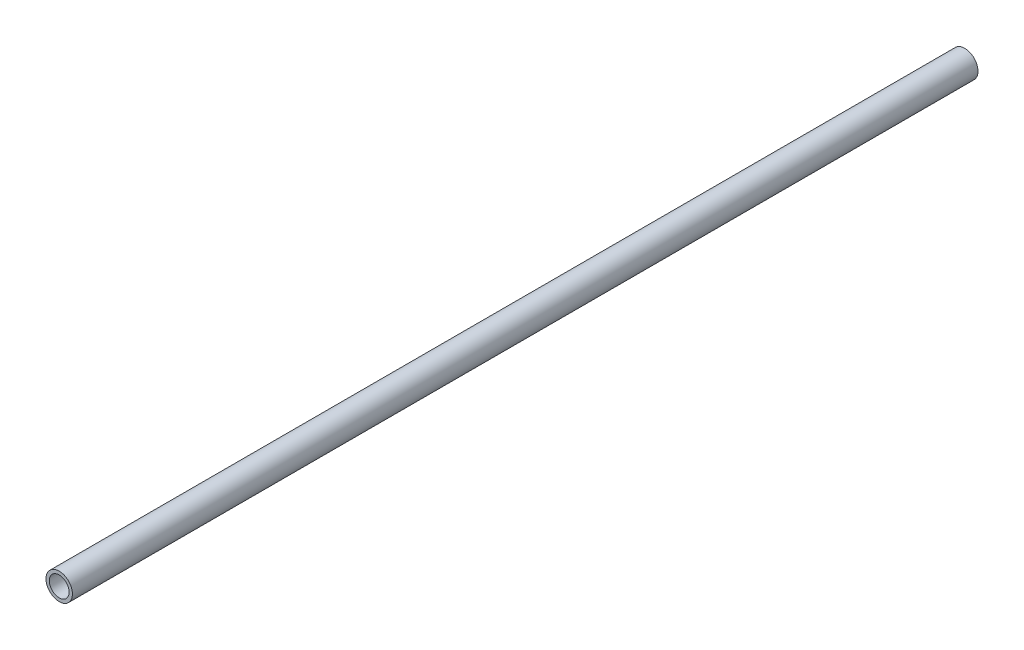
ISO-10303-21;
HEADER;
FILE_DESCRIPTION(('STEP AP214'),'2;1');
FILE_NAME('part.step','',(''),(''),'','','');
FILE_SCHEMA(('AUTOMOTIVE_DESIGN { 1 0 10303 214 1 1 1 1 }'));
ENDSEC;
DATA;
#1=APPLICATION_CONTEXT('core data for automotive mechanical design processes');
#2=APPLICATION_PROTOCOL_DEFINITION('international standard','automotive_design',2000,#1);
#3=PRODUCT_CONTEXT('',#1,'mechanical');
#4=PRODUCT('Part','Part','',(#3));
#5=PRODUCT_RELATED_PRODUCT_CATEGORY('part','',(#4));
#6=PRODUCT_DEFINITION_FORMATION('','',#4);
#7=PRODUCT_DEFINITION_CONTEXT('part definition',#1,'design');
#8=PRODUCT_DEFINITION('design','',#6,#7);
#9=PRODUCT_DEFINITION_SHAPE('','',#8);
#10=(LENGTH_UNIT() NAMED_UNIT(*) SI_UNIT(.MILLI.,.METRE.));
#11=(NAMED_UNIT(*) PLANE_ANGLE_UNIT() SI_UNIT($,.RADIAN.));
#12=(NAMED_UNIT(*) SI_UNIT($,.STERADIAN.) SOLID_ANGLE_UNIT());
#13=UNCERTAINTY_MEASURE_WITH_UNIT(LENGTH_MEASURE(1.E-05),#10,'distance_accuracy_value','');
#14=(GEOMETRIC_REPRESENTATION_CONTEXT(3) GLOBAL_UNCERTAINTY_ASSIGNED_CONTEXT((#13)) GLOBAL_UNIT_ASSIGNED_CONTEXT((#10,
#11,#12)) REPRESENTATION_CONTEXT('',''));
#15=CARTESIAN_POINT('',(0.,0.,0.));
#16=DIRECTION('',(0.,0.,1.));
#17=DIRECTION('',(1.,0.,0.));
#18=AXIS2_PLACEMENT_3D('',#15,#16,#17);
#19=CARTESIAN_POINT('',(0.,0.,137.));
#20=DIRECTION('',(0.,0.,1.));
#21=DIRECTION('',(1.,0.,0.));
#22=AXIS2_PLACEMENT_3D('',#19,#20,#21);
#23=PLANE('',#22);
#24=CARTESIAN_POINT('',(0.,0.,137.));
#25=DIRECTION('',(0.,0.,1.));
#26=DIRECTION('',(1.,0.,0.));
#27=AXIS2_PLACEMENT_3D('',#24,#25,#26);
#28=CIRCLE('',#27,2.);
#29=CARTESIAN_POINT('',(2.,0.,137.));
#30=VERTEX_POINT('',#29);
#31=EDGE_CURVE('E13',#30,#30,#28,.T.);
#32=ORIENTED_EDGE('',*,*,#31,.T.);
#33=EDGE_LOOP('',(#32));
#34=FACE_BOUND('',#33,.T.);
#35=CARTESIAN_POINT('',(0.,0.,137.));
#36=DIRECTION('',(0.,0.,1.));
#37=DIRECTION('',(1.,0.,0.));
#38=AXIS2_PLACEMENT_3D('',#35,#36,#37);
#39=CIRCLE('',#38,1.5);
#40=CARTESIAN_POINT('',(1.5,0.,137.));
#41=VERTEX_POINT('',#40);
#42=EDGE_CURVE('E60',#41,#41,#39,.T.);
#43=ORIENTED_EDGE('',*,*,#42,.F.);
#44=EDGE_LOOP('',(#43));
#45=FACE_BOUND('',#44,.T.);
#46=ADVANCED_FACE('F49',(#34,#45),#23,.T.);
#47=CARTESIAN_POINT('',(0.,0.,0.));
#48=DIRECTION('',(0.,0.,1.));
#49=DIRECTION('',(1.,0.,0.));
#50=AXIS2_PLACEMENT_3D('',#47,#48,#49);
#51=PLANE('',#50);
#52=CARTESIAN_POINT('',(0.,0.,0.));
#53=DIRECTION('',(0.,0.,1.));
#54=DIRECTION('',(1.,0.,0.));
#55=AXIS2_PLACEMENT_3D('',#52,#53,#54);
#56=CIRCLE('',#55,2.);
#57=CARTESIAN_POINT('',(2.,0.,0.));
#58=VERTEX_POINT('',#57);
#59=EDGE_CURVE('E53',#58,#58,#56,.T.);
#60=ORIENTED_EDGE('',*,*,#59,.F.);
#61=EDGE_LOOP('',(#60));
#62=FACE_BOUND('',#61,.T.);
#63=CARTESIAN_POINT('',(0.,0.,0.));
#64=DIRECTION('',(0.,0.,1.));
#65=DIRECTION('',(1.,0.,0.));
#66=AXIS2_PLACEMENT_3D('',#63,#64,#65);
#67=CIRCLE('',#66,1.5);
#68=CARTESIAN_POINT('',(1.5,0.,0.));
#69=VERTEX_POINT('',#68);
#70=EDGE_CURVE('E62',#69,#69,#67,.T.);
#71=ORIENTED_EDGE('',*,*,#70,.T.);
#72=EDGE_LOOP('',(#71));
#73=FACE_BOUND('',#72,.T.);
#74=ADVANCED_FACE('F72',(#62,#73),#51,.F.);
#75=CARTESIAN_POINT('',(0.,0.,137.));
#76=DIRECTION('',(0.,0.,-1.));
#77=DIRECTION('',(-1.,0.,0.));
#78=AXIS2_PLACEMENT_3D('',#75,#76,#77);
#79=CYLINDRICAL_SURFACE('',#78,2.);
#80=ORIENTED_EDGE('',*,*,#31,.F.);
#81=EDGE_LOOP('',(#80));
#82=FACE_BOUND('',#81,.T.);
#83=ORIENTED_EDGE('',*,*,#59,.T.);
#84=EDGE_LOOP('',(#83));
#85=FACE_BOUND('',#84,.T.);
#86=ADVANCED_FACE('F51',(#82,#85),#79,.T.);
#87=CARTESIAN_POINT('',(0.,0.,137.));
#88=DIRECTION('',(0.,0.,-1.));
#89=DIRECTION('',(-1.,0.,0.));
#90=AXIS2_PLACEMENT_3D('',#87,#88,#89);
#91=CYLINDRICAL_SURFACE('',#90,1.5);
#92=ORIENTED_EDGE('',*,*,#42,.T.);
#93=EDGE_LOOP('',(#92));
#94=FACE_BOUND('',#93,.T.);
#95=ORIENTED_EDGE('',*,*,#70,.F.);
#96=EDGE_LOOP('',(#95));
#97=FACE_BOUND('',#96,.T.);
#98=ADVANCED_FACE('F68',(#94,#97),#91,.F.);
#99=CLOSED_SHELL('',(#46,#74,#86,#98));
#100=MANIFOLD_SOLID_BREP('B2',#99);
#101=ADVANCED_BREP_SHAPE_REPRESENTATION('',(#18,#100),#14);
#102=SHAPE_DEFINITION_REPRESENTATION(#9,#101);
ENDSEC;
END-ISO-10303-21;
